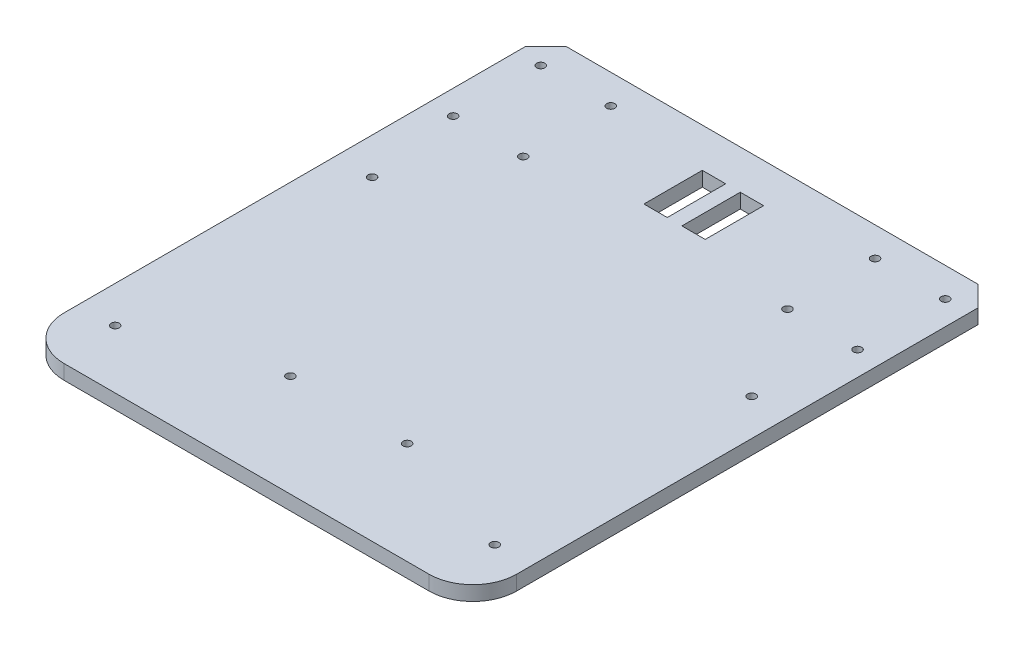
ISO-10303-21;
HEADER;
FILE_DESCRIPTION(('STEP AP214'),'2;1');
FILE_NAME('part.step','',(''),(''),'','','');
FILE_SCHEMA(('AUTOMOTIVE_DESIGN { 1 0 10303 214 1 1 1 1 }'));
ENDSEC;
DATA;
#1=APPLICATION_CONTEXT('core data for automotive mechanical design processes');
#2=APPLICATION_PROTOCOL_DEFINITION('international standard','automotive_design',2000,#1);
#3=PRODUCT_CONTEXT('',#1,'mechanical');
#4=PRODUCT('Part','Part','',(#3));
#5=PRODUCT_RELATED_PRODUCT_CATEGORY('part','',(#4));
#6=PRODUCT_DEFINITION_FORMATION('','',#4);
#7=PRODUCT_DEFINITION_CONTEXT('part definition',#1,'design');
#8=PRODUCT_DEFINITION('design','',#6,#7);
#9=PRODUCT_DEFINITION_SHAPE('','',#8);
#10=(LENGTH_UNIT() NAMED_UNIT(*) SI_UNIT(.MILLI.,.METRE.));
#11=(NAMED_UNIT(*) PLANE_ANGLE_UNIT() SI_UNIT($,.RADIAN.));
#12=(NAMED_UNIT(*) SI_UNIT($,.STERADIAN.) SOLID_ANGLE_UNIT());
#13=UNCERTAINTY_MEASURE_WITH_UNIT(LENGTH_MEASURE(1.E-05),#10,'distance_accuracy_value','');
#14=(GEOMETRIC_REPRESENTATION_CONTEXT(3) GLOBAL_UNCERTAINTY_ASSIGNED_CONTEXT((#13)) GLOBAL_UNIT_ASSIGNED_CONTEXT((#10,
#11,#12)) REPRESENTATION_CONTEXT('',''));
#15=CARTESIAN_POINT('',(0.,0.,0.));
#16=DIRECTION('',(0.,0.,1.));
#17=DIRECTION('',(1.,0.,0.));
#18=AXIS2_PLACEMENT_3D('',#15,#16,#17);
#19=CARTESIAN_POINT('',(-77.5,5.,90.));
#20=DIRECTION('',(1.,0.,0.));
#21=DIRECTION('',(0.,0.,-1.));
#22=AXIS2_PLACEMENT_3D('',#19,#20,#21);
#23=PLANE('',#22);
#24=DIRECTION('',(0.,0.,1.));
#25=VECTOR('',#24,1.);
#26=CARTESIAN_POINT('',(-77.5,5.,90.));
#27=LINE('',#26,#25);
#28=CARTESIAN_POINT('',(-77.5,5.,-83.));
#29=VERTEX_POINT('',#28);
#30=CARTESIAN_POINT('',(-77.5,5.,75.));
#31=VERTEX_POINT('',#30);
#32=EDGE_CURVE('E174',#29,#31,#27,.T.);
#33=ORIENTED_EDGE('',*,*,#32,.F.);
#34=DIRECTION('',(0.,1.,0.));
#35=VECTOR('',#34,1.);
#36=CARTESIAN_POINT('',(-77.5,0.,-83.));
#37=LINE('',#36,#35);
#38=CARTESIAN_POINT('',(-77.5,0.,-83.));
#39=VERTEX_POINT('',#38);
#40=EDGE_CURVE('E160',#39,#29,#37,.T.);
#41=ORIENTED_EDGE('',*,*,#40,.F.);
#42=DIRECTION('',(0.,0.,1.));
#43=VECTOR('',#42,1.);
#44=CARTESIAN_POINT('',(-77.5,0.,90.));
#45=LINE('',#44,#43);
#46=CARTESIAN_POINT('',(-77.5,0.,75.));
#47=VERTEX_POINT('',#46);
#48=EDGE_CURVE('E172',#39,#47,#45,.T.);
#49=ORIENTED_EDGE('',*,*,#48,.T.);
#50=DIRECTION('',(0.,1.,0.));
#51=VECTOR('',#50,1.);
#52=CARTESIAN_POINT('',(-77.5,0.,75.));
#53=LINE('',#52,#51);
#54=EDGE_CURVE('E330',#47,#31,#53,.T.);
#55=ORIENTED_EDGE('',*,*,#54,.T.);
#56=EDGE_LOOP('',(#33,#41,#49,#55));
#57=FACE_BOUND('',#56,.T.);
#58=ADVANCED_FACE('F45',(#57),#23,.F.);
#59=CARTESIAN_POINT('',(77.5,5.,90.));
#60=DIRECTION('',(0.,0.,-1.));
#61=DIRECTION('',(-1.,0.,0.));
#62=AXIS2_PLACEMENT_3D('',#59,#60,#61);
#63=PLANE('',#62);
#64=DIRECTION('',(1.,0.,0.));
#65=VECTOR('',#64,1.);
#66=CARTESIAN_POINT('',(77.5,5.,90.));
#67=LINE('',#66,#65);
#68=CARTESIAN_POINT('',(-62.5,5.,90.));
#69=VERTEX_POINT('',#68);
#70=CARTESIAN_POINT('',(62.5,5.,89.9999999999999));
#71=VERTEX_POINT('',#70);
#72=EDGE_CURVE('E440',#69,#71,#67,.T.);
#73=ORIENTED_EDGE('',*,*,#72,.F.);
#74=DIRECTION('',(0.,1.,0.));
#75=VECTOR('',#74,1.);
#76=CARTESIAN_POINT('',(-62.5,0.,90.));
#77=LINE('',#76,#75);
#78=CARTESIAN_POINT('',(-62.5,0.,90.));
#79=VERTEX_POINT('',#78);
#80=EDGE_CURVE('E324',#79,#69,#77,.T.);
#81=ORIENTED_EDGE('',*,*,#80,.F.);
#82=DIRECTION('',(1.,0.,0.));
#83=VECTOR('',#82,1.);
#84=CARTESIAN_POINT('',(77.5,0.,90.));
#85=LINE('',#84,#83);
#86=CARTESIAN_POINT('',(62.5,0.,90.));
#87=VERTEX_POINT('',#86);
#88=EDGE_CURVE('E182',#79,#87,#85,.T.);
#89=ORIENTED_EDGE('',*,*,#88,.T.);
#90=DIRECTION('',(0.,1.,0.));
#91=VECTOR('',#90,1.);
#92=CARTESIAN_POINT('',(62.5,0.,89.9999999999999));
#93=LINE('',#92,#91);
#94=EDGE_CURVE('E336',#87,#71,#93,.T.);
#95=ORIENTED_EDGE('',*,*,#94,.T.);
#96=EDGE_LOOP('',(#73,#81,#89,#95));
#97=FACE_BOUND('',#96,.T.);
#98=ADVANCED_FACE('F466',(#97),#63,.F.);
#99=CARTESIAN_POINT('',(77.5,5.,90.));
#100=DIRECTION('',(-1.,0.,0.));
#101=DIRECTION('',(0.,0.,1.));
#102=AXIS2_PLACEMENT_3D('',#99,#100,#101);
#103=PLANE('',#102);
#104=DIRECTION('',(0.,0.,-1.));
#105=VECTOR('',#104,1.);
#106=CARTESIAN_POINT('',(77.5,0.,90.));
#107=LINE('',#106,#105);
#108=CARTESIAN_POINT('',(77.5,0.,74.9999999999999));
#109=VERTEX_POINT('',#108);
#110=CARTESIAN_POINT('',(77.5,0.,-82.9999999999999));
#111=VERTEX_POINT('',#110);
#112=EDGE_CURVE('E188',#109,#111,#107,.T.);
#113=ORIENTED_EDGE('',*,*,#112,.T.);
#114=DIRECTION('',(0.,1.,0.));
#115=VECTOR('',#114,1.);
#116=CARTESIAN_POINT('',(77.5,0.,-83.));
#117=LINE('',#116,#115);
#118=CARTESIAN_POINT('',(77.5,5.,-83.));
#119=VERTEX_POINT('',#118);
#120=EDGE_CURVE('E62',#111,#119,#117,.T.);
#121=ORIENTED_EDGE('',*,*,#120,.T.);
#122=DIRECTION('',(0.,0.,-1.));
#123=VECTOR('',#122,1.);
#124=CARTESIAN_POINT('',(77.5,5.,90.));
#125=LINE('',#124,#123);
#126=CARTESIAN_POINT('',(77.5,5.,74.9999999999999));
#127=VERTEX_POINT('',#126);
#128=EDGE_CURVE('E54',#127,#119,#125,.T.);
#129=ORIENTED_EDGE('',*,*,#128,.F.);
#130=DIRECTION('',(0.,1.,0.));
#131=VECTOR('',#130,1.);
#132=CARTESIAN_POINT('',(77.5,0.,74.9999999999999));
#133=LINE('',#132,#131);
#134=EDGE_CURVE('E270',#109,#127,#133,.T.);
#135=ORIENTED_EDGE('',*,*,#134,.F.);
#136=EDGE_LOOP('',(#113,#121,#129,#135));
#137=FACE_BOUND('',#136,.T.);
#138=ADVANCED_FACE('F454',(#137),#103,.F.);
#139=CARTESIAN_POINT('',(77.5,5.,-90.));
#140=DIRECTION('',(0.,0.,1.));
#141=DIRECTION('',(1.,0.,0.));
#142=AXIS2_PLACEMENT_3D('',#139,#140,#141);
#143=PLANE('',#142);
#144=DIRECTION('',(-1.,0.,0.));
#145=VECTOR('',#144,1.);
#146=CARTESIAN_POINT('',(77.5,0.,-90.));
#147=LINE('',#146,#145);
#148=CARTESIAN_POINT('',(70.5,0.,-90.));
#149=VERTEX_POINT('',#148);
#150=CARTESIAN_POINT('',(-70.4999999999999,0.,-90.));
#151=VERTEX_POINT('',#150);
#152=EDGE_CURVE('E198',#149,#151,#147,.T.);
#153=ORIENTED_EDGE('',*,*,#152,.T.);
#154=DIRECTION('',(0.,1.,0.));
#155=VECTOR('',#154,1.);
#156=CARTESIAN_POINT('',(-70.5,0.,-90.));
#157=LINE('',#156,#155);
#158=CARTESIAN_POINT('',(-70.5,5.,-90.));
#159=VERTEX_POINT('',#158);
#160=EDGE_CURVE('E70',#151,#159,#157,.T.);
#161=ORIENTED_EDGE('',*,*,#160,.T.);
#162=DIRECTION('',(-1.,0.,0.));
#163=VECTOR('',#162,1.);
#164=CARTESIAN_POINT('',(77.5,5.,-90.));
#165=LINE('',#164,#163);
#166=CARTESIAN_POINT('',(70.5,5.,-90.));
#167=VERTEX_POINT('',#166);
#168=EDGE_CURVE('E11',#167,#159,#165,.T.);
#169=ORIENTED_EDGE('',*,*,#168,.F.);
#170=DIRECTION('',(0.,1.,0.));
#171=VECTOR('',#170,1.);
#172=CARTESIAN_POINT('',(70.5,0.,-90.));
#173=LINE('',#172,#171);
#174=EDGE_CURVE('E224',#149,#167,#173,.T.);
#175=ORIENTED_EDGE('',*,*,#174,.F.);
#176=EDGE_LOOP('',(#153,#161,#169,#175));
#177=FACE_BOUND('',#176,.T.);
#178=ADVANCED_FACE('F459',(#177),#143,.F.);
#179=CARTESIAN_POINT('',(0.,5.,0.));
#180=DIRECTION('',(0.,1.,0.));
#181=DIRECTION('',(0.,0.,1.));
#182=AXIS2_PLACEMENT_3D('',#179,#180,#181);
#183=PLANE('',#182);
#184=CARTESIAN_POINT('',(-20.,5.,55.));
#185=DIRECTION('',(0.,1.,0.));
#186=DIRECTION('',(0.,0.,1.));
#187=AXIS2_PLACEMENT_3D('',#184,#185,#186);
#188=CIRCLE('',#187,1.4);
#189=CARTESIAN_POINT('',(-20.,5.,56.4));
#190=VERTEX_POINT('',#189);
#191=EDGE_CURVE('E203',#190,#190,#188,.T.);
#192=ORIENTED_EDGE('',*,*,#191,.F.);
#193=EDGE_LOOP('',(#192));
#194=FACE_BOUND('',#193,.T.);
#195=CARTESIAN_POINT('',(20.,5.,54.9999999999999));
#196=DIRECTION('',(0.,1.,0.));
#197=DIRECTION('',(0.,0.,-1.));
#198=AXIS2_PLACEMENT_3D('',#195,#196,#197);
#199=CIRCLE('',#198,1.4);
#200=CARTESIAN_POINT('',(20.,5.,53.5999999999999));
#201=VERTEX_POINT('',#200);
#202=EDGE_CURVE('E210',#201,#201,#199,.T.);
#203=ORIENTED_EDGE('',*,*,#202,.F.);
#204=EDGE_LOOP('',(#203));
#205=FACE_BOUND('',#204,.T.);
#206=DIRECTION('',(0.707106781186547,0.,-0.707106781186547));
#207=VECTOR('',#206,1.);
#208=CARTESIAN_POINT('',(-70.5,5.,-90.));
#209=LINE('',#208,#207);
#210=EDGE_CURVE('E167',#29,#159,#209,.T.);
#211=ORIENTED_EDGE('',*,*,#210,.F.);
#212=ORIENTED_EDGE('',*,*,#32,.T.);
#213=CARTESIAN_POINT('',(-62.5,5.,75.));
#214=DIRECTION('',(0.,-1.,0.));
#215=DIRECTION('',(0.,0.,-1.));
#216=AXIS2_PLACEMENT_3D('',#213,#214,#215);
#217=CIRCLE('',#216,15.);
#218=EDGE_CURVE('E325',#69,#31,#217,.T.);
#219=ORIENTED_EDGE('',*,*,#218,.F.);
#220=ORIENTED_EDGE('',*,*,#72,.T.);
#221=CARTESIAN_POINT('',(62.5,5.,74.9999999999999));
#222=DIRECTION('',(0.,-1.,0.));
#223=DIRECTION('',(0.,0.,1.));
#224=AXIS2_PLACEMENT_3D('',#221,#222,#223);
#225=CIRCLE('',#224,15.);
#226=EDGE_CURVE('E329',#127,#71,#225,.T.);
#227=ORIENTED_EDGE('',*,*,#226,.F.);
#228=ORIENTED_EDGE('',*,*,#128,.T.);
#229=DIRECTION('',(0.707106781186547,0.,0.707106781186547));
#230=VECTOR('',#229,1.);
#231=CARTESIAN_POINT('',(70.5,5.,-90.));
#232=LINE('',#231,#230);
#233=EDGE_CURVE('E220',#167,#119,#232,.T.);
#234=ORIENTED_EDGE('',*,*,#233,.F.);
#235=ORIENTED_EDGE('',*,*,#168,.T.);
#236=EDGE_LOOP('',(#211,#212,#219,#220,#227,#228,#234,#235));
#237=FACE_BOUND('',#236,.T.);
#238=DIRECTION('',(0.,0.,-1.));
#239=VECTOR('',#238,1.);
#240=CARTESIAN_POINT('',(10.5,5.,-76.5855008301052));
#241=LINE('',#240,#239);
#242=CARTESIAN_POINT('',(10.5,5.,-56.5855008301052));
#243=VERTEX_POINT('',#242);
#244=CARTESIAN_POINT('',(10.5,5.,-76.5855008301052));
#245=VERTEX_POINT('',#244);
#246=EDGE_CURVE('E252',#243,#245,#241,.T.);
#247=ORIENTED_EDGE('',*,*,#246,.F.);
#248=DIRECTION('',(1.,0.,0.));
#249=VECTOR('',#248,1.);
#250=CARTESIAN_POINT('',(2.50000000000003,5.,-56.5855008301052));
#251=LINE('',#250,#249);
#252=CARTESIAN_POINT('',(2.50000000000003,5.,-56.5855008301052));
#253=VERTEX_POINT('',#252);
#254=EDGE_CURVE('E239',#253,#243,#251,.T.);
#255=ORIENTED_EDGE('',*,*,#254,.F.);
#256=DIRECTION('',(0.,0.,1.));
#257=VECTOR('',#256,1.);
#258=CARTESIAN_POINT('',(2.50000000000002,5.,-76.5855008301052));
#259=LINE('',#258,#257);
#260=CARTESIAN_POINT('',(2.50000000000002,5.,-76.5855008301052));
#261=VERTEX_POINT('',#260);
#262=EDGE_CURVE('E260',#261,#253,#259,.T.);
#263=ORIENTED_EDGE('',*,*,#262,.F.);
#264=DIRECTION('',(-1.,0.,0.));
#265=VECTOR('',#264,1.);
#266=CARTESIAN_POINT('',(2.50000000000002,5.,-76.5855008301052));
#267=LINE('',#266,#265);
#268=EDGE_CURVE('E255',#245,#261,#267,.T.);
#269=ORIENTED_EDGE('',*,*,#268,.F.);
#270=EDGE_LOOP('',(#247,#255,#263,#269));
#271=FACE_BOUND('',#270,.T.);
#272=DIRECTION('',(0.,0.,-1.));
#273=VECTOR('',#272,1.);
#274=CARTESIAN_POINT('',(-2.49999999999999,5.,-76.5855008301052));
#275=LINE('',#274,#273);
#276=CARTESIAN_POINT('',(-2.5,5.,-56.5855008301052));
#277=VERTEX_POINT('',#276);
#278=CARTESIAN_POINT('',(-2.49999999999999,5.,-76.5855008301052));
#279=VERTEX_POINT('',#278);
#280=EDGE_CURVE('E256',#277,#279,#275,.T.);
#281=ORIENTED_EDGE('',*,*,#280,.F.);
#282=DIRECTION('',(1.,0.,0.));
#283=VECTOR('',#282,1.);
#284=CARTESIAN_POINT('',(-2.5,5.,-56.5855008301052));
#285=LINE('',#284,#283);
#286=CARTESIAN_POINT('',(-10.5,5.,-56.5855008301052));
#287=VERTEX_POINT('',#286);
#288=EDGE_CURVE('E293',#287,#277,#285,.T.);
#289=ORIENTED_EDGE('',*,*,#288,.F.);
#290=DIRECTION('',(0.,0.,1.));
#291=VECTOR('',#290,1.);
#292=CARTESIAN_POINT('',(-10.5,5.,-76.5855008301052));
#293=LINE('',#292,#291);
#294=CARTESIAN_POINT('',(-10.5,5.,-76.5855008301052));
#295=VERTEX_POINT('',#294);
#296=EDGE_CURVE('E297',#295,#287,#293,.T.);
#297=ORIENTED_EDGE('',*,*,#296,.F.);
#298=DIRECTION('',(-1.,0.,0.));
#299=VECTOR('',#298,1.);
#300=CARTESIAN_POINT('',(-2.49999999999999,5.,-76.5855008301052));
#301=LINE('',#300,#299);
#302=EDGE_CURVE('E302',#279,#295,#301,.T.);
#303=ORIENTED_EDGE('',*,*,#302,.F.);
#304=EDGE_LOOP('',(#281,#289,#297,#303));
#305=FACE_BOUND('',#304,.T.);
#306=CARTESIAN_POINT('',(65.,5.,-18.));
#307=DIRECTION('',(0.,1.,0.));
#308=DIRECTION('',(0.,0.,-1.));
#309=AXIS2_PLACEMENT_3D('',#306,#307,#308);
#310=CIRCLE('',#309,1.4);
#311=CARTESIAN_POINT('',(65.,5.,-19.4));
#312=VERTEX_POINT('',#311);
#313=EDGE_CURVE('E356',#312,#312,#310,.T.);
#314=ORIENTED_EDGE('',*,*,#313,.F.);
#315=EDGE_LOOP('',(#314));
#316=FACE_BOUND('',#315,.T.);
#317=CARTESIAN_POINT('',(-65.,5.,70.));
#318=DIRECTION('',(0.,1.,0.));
#319=DIRECTION('',(0.,0.,1.));
#320=AXIS2_PLACEMENT_3D('',#317,#318,#319);
#321=CIRCLE('',#320,1.4);
#322=CARTESIAN_POINT('',(-65.,5.,71.4));
#323=VERTEX_POINT('',#322);
#324=EDGE_CURVE('E365',#323,#323,#321,.T.);
#325=ORIENTED_EDGE('',*,*,#324,.F.);
#326=EDGE_LOOP('',(#325));
#327=FACE_BOUND('',#326,.T.);
#328=CARTESIAN_POINT('',(65.,5.,69.9999999999999));
#329=DIRECTION('',(0.,1.,0.));
#330=DIRECTION('',(0.,0.,-1.));
#331=AXIS2_PLACEMENT_3D('',#328,#329,#330);
#332=CIRCLE('',#331,1.4);
#333=CARTESIAN_POINT('',(65.,5.,68.5999999999999));
#334=VERTEX_POINT('',#333);
#335=EDGE_CURVE('E348',#334,#334,#332,.T.);
#336=ORIENTED_EDGE('',*,*,#335,.F.);
#337=EDGE_LOOP('',(#336));
#338=FACE_BOUND('',#337,.T.);
#339=CARTESIAN_POINT('',(-65.,5.,-18.));
#340=DIRECTION('',(0.,1.,0.));
#341=DIRECTION('',(0.,0.,1.));
#342=AXIS2_PLACEMENT_3D('',#339,#340,#341);
#343=CIRCLE('',#342,1.4);
#344=CARTESIAN_POINT('',(-65.,5.,-16.6));
#345=VERTEX_POINT('',#344);
#346=EDGE_CURVE('E360',#345,#345,#343,.T.);
#347=ORIENTED_EDGE('',*,*,#346,.F.);
#348=EDGE_LOOP('',(#347));
#349=FACE_BOUND('',#348,.T.);
#350=CARTESIAN_POINT('',(-69.25,5.,-50.));
#351=DIRECTION('',(0.,1.,0.));
#352=DIRECTION('',(0.,0.,1.));
#353=AXIS2_PLACEMENT_3D('',#350,#351,#352);
#354=CIRCLE('',#353,1.4);
#355=CARTESIAN_POINT('',(-69.25,5.,-48.6));
#356=VERTEX_POINT('',#355);
#357=EDGE_CURVE('E404',#356,#356,#354,.T.);
#358=ORIENTED_EDGE('',*,*,#357,.F.);
#359=EDGE_LOOP('',(#358));
#360=FACE_BOUND('',#359,.T.);
#361=CARTESIAN_POINT('',(-45.25,5.,-50.));
#362=DIRECTION('',(0.,1.,0.));
#363=DIRECTION('',(0.,0.,1.));
#364=AXIS2_PLACEMENT_3D('',#361,#362,#363);
#365=CIRCLE('',#364,1.4);
#366=CARTESIAN_POINT('',(-45.25,5.,-48.6));
#367=VERTEX_POINT('',#366);
#368=EDGE_CURVE('E412',#367,#367,#365,.T.);
#369=ORIENTED_EDGE('',*,*,#368,.F.);
#370=EDGE_LOOP('',(#369));
#371=FACE_BOUND('',#370,.T.);
#372=CARTESIAN_POINT('',(-45.25,5.,-80.));
#373=DIRECTION('',(0.,1.,0.));
#374=DIRECTION('',(0.,0.,1.));
#375=AXIS2_PLACEMENT_3D('',#372,#373,#374);
#376=CIRCLE('',#375,1.4);
#377=CARTESIAN_POINT('',(-45.25,5.,-78.6));
#378=VERTEX_POINT('',#377);
#379=EDGE_CURVE('E420',#378,#378,#376,.T.);
#380=ORIENTED_EDGE('',*,*,#379,.F.);
#381=EDGE_LOOP('',(#380));
#382=FACE_BOUND('',#381,.T.);
#383=CARTESIAN_POINT('',(45.25,5.,-80.));
#384=DIRECTION('',(0.,1.,0.));
#385=DIRECTION('',(0.,0.,-1.));
#386=AXIS2_PLACEMENT_3D('',#383,#384,#385);
#387=CIRCLE('',#386,1.4);
#388=CARTESIAN_POINT('',(45.25,5.,-81.4));
#389=VERTEX_POINT('',#388);
#390=EDGE_CURVE('E428',#389,#389,#387,.T.);
#391=ORIENTED_EDGE('',*,*,#390,.F.);
#392=EDGE_LOOP('',(#391));
#393=FACE_BOUND('',#392,.T.);
#394=CARTESIAN_POINT('',(45.25,5.,-50.));
#395=DIRECTION('',(0.,1.,0.));
#396=DIRECTION('',(0.,0.,-1.));
#397=AXIS2_PLACEMENT_3D('',#394,#395,#396);
#398=CIRCLE('',#397,1.4);
#399=CARTESIAN_POINT('',(45.25,5.,-51.4));
#400=VERTEX_POINT('',#399);
#401=EDGE_CURVE('E380',#400,#400,#398,.T.);
#402=ORIENTED_EDGE('',*,*,#401,.F.);
#403=EDGE_LOOP('',(#402));
#404=FACE_BOUND('',#403,.T.);
#405=CARTESIAN_POINT('',(69.25,5.,-50.0000000000001));
#406=DIRECTION('',(0.,1.,0.));
#407=DIRECTION('',(0.,0.,-1.));
#408=AXIS2_PLACEMENT_3D('',#405,#406,#407);
#409=CIRCLE('',#408,1.4);
#410=CARTESIAN_POINT('',(69.25,5.,-51.4000000000001));
#411=VERTEX_POINT('',#410);
#412=EDGE_CURVE('E389',#411,#411,#409,.T.);
#413=ORIENTED_EDGE('',*,*,#412,.F.);
#414=EDGE_LOOP('',(#413));
#415=FACE_BOUND('',#414,.T.);
#416=CARTESIAN_POINT('',(69.25,5.,-80.));
#417=DIRECTION('',(0.,1.,0.));
#418=DIRECTION('',(0.,0.,-1.));
#419=AXIS2_PLACEMENT_3D('',#416,#417,#418);
#420=CIRCLE('',#419,1.4);
#421=CARTESIAN_POINT('',(69.25,5.,-81.4));
#422=VERTEX_POINT('',#421);
#423=EDGE_CURVE('E397',#422,#422,#420,.T.);
#424=ORIENTED_EDGE('',*,*,#423,.F.);
#425=EDGE_LOOP('',(#424));
#426=FACE_BOUND('',#425,.T.);
#427=CARTESIAN_POINT('',(-69.25,5.,-80.));
#428=DIRECTION('',(0.,1.,0.));
#429=DIRECTION('',(0.,0.,1.));
#430=AXIS2_PLACEMENT_3D('',#427,#428,#429);
#431=CIRCLE('',#430,1.4);
#432=CARTESIAN_POINT('',(-69.25,5.,-78.6));
#433=VERTEX_POINT('',#432);
#434=EDGE_CURVE('E191',#433,#433,#431,.T.);
#435=ORIENTED_EDGE('',*,*,#434,.F.);
#436=EDGE_LOOP('',(#435));
#437=FACE_BOUND('',#436,.T.);
#438=ADVANCED_FACE('F449',(#194,#205,#237,#271,#305,#316,#327,#338,#349,#360,#371,#382,#393,
#404,#415,#426,#437),#183,.T.);
#439=CARTESIAN_POINT('',(0.,0.,0.));
#440=DIRECTION('',(0.,1.,0.));
#441=DIRECTION('',(0.,0.,1.));
#442=AXIS2_PLACEMENT_3D('',#439,#440,#441);
#443=PLANE('',#442);
#444=CARTESIAN_POINT('',(-20.,0.,55.));
#445=DIRECTION('',(0.,1.,0.));
#446=DIRECTION('',(0.,0.,1.));
#447=AXIS2_PLACEMENT_3D('',#444,#445,#446);
#448=CIRCLE('',#447,1.4);
#449=CARTESIAN_POINT('',(-20.,0.,56.4));
#450=VERTEX_POINT('',#449);
#451=EDGE_CURVE('E48',#450,#450,#448,.T.);
#452=ORIENTED_EDGE('',*,*,#451,.T.);
#453=EDGE_LOOP('',(#452));
#454=FACE_BOUND('',#453,.T.);
#455=CARTESIAN_POINT('',(20.,0.,54.9999999999999));
#456=DIRECTION('',(0.,1.,0.));
#457=DIRECTION('',(0.,0.,1.));
#458=AXIS2_PLACEMENT_3D('',#455,#456,#457);
#459=CIRCLE('',#458,1.4);
#460=CARTESIAN_POINT('',(20.,0.,56.3999999999999));
#461=VERTEX_POINT('',#460);
#462=EDGE_CURVE('E200',#461,#461,#459,.T.);
#463=ORIENTED_EDGE('',*,*,#462,.T.);
#464=EDGE_LOOP('',(#463));
#465=FACE_BOUND('',#464,.T.);
#466=DIRECTION('',(1.,0.,0.));
#467=VECTOR('',#466,1.);
#468=CARTESIAN_POINT('',(2.50000000000003,0.,-56.5855008301052));
#469=LINE('',#468,#467);
#470=CARTESIAN_POINT('',(2.50000000000003,0.,-56.5855008301052));
#471=VERTEX_POINT('',#470);
#472=CARTESIAN_POINT('',(10.5,0.,-56.5855008301052));
#473=VERTEX_POINT('',#472);
#474=EDGE_CURVE('E247',#471,#473,#469,.T.);
#475=ORIENTED_EDGE('',*,*,#474,.T.);
#476=DIRECTION('',(0.,0.,-1.));
#477=VECTOR('',#476,1.);
#478=CARTESIAN_POINT('',(10.5,0.,-76.5855008301052));
#479=LINE('',#478,#477);
#480=CARTESIAN_POINT('',(10.5,0.,-76.5855008301052));
#481=VERTEX_POINT('',#480);
#482=EDGE_CURVE('E234',#473,#481,#479,.T.);
#483=ORIENTED_EDGE('',*,*,#482,.T.);
#484=DIRECTION('',(-1.,0.,0.));
#485=VECTOR('',#484,1.);
#486=CARTESIAN_POINT('',(2.50000000000002,0.,-76.5855008301052));
#487=LINE('',#486,#485);
#488=CARTESIAN_POINT('',(2.50000000000002,0.,-76.5855008301052));
#489=VERTEX_POINT('',#488);
#490=EDGE_CURVE('E238',#481,#489,#487,.T.);
#491=ORIENTED_EDGE('',*,*,#490,.T.);
#492=DIRECTION('',(0.,0.,1.));
#493=VECTOR('',#492,1.);
#494=CARTESIAN_POINT('',(2.50000000000002,0.,-76.5855008301052));
#495=LINE('',#494,#493);
#496=EDGE_CURVE('E243',#489,#471,#495,.T.);
#497=ORIENTED_EDGE('',*,*,#496,.T.);
#498=EDGE_LOOP('',(#475,#483,#491,#497));
#499=FACE_BOUND('',#498,.T.);
#500=DIRECTION('',(1.,0.,0.));
#501=VECTOR('',#500,1.);
#502=CARTESIAN_POINT('',(-2.5,0.,-56.5855008301052));
#503=LINE('',#502,#501);
#504=CARTESIAN_POINT('',(-10.5,0.,-56.5855008301052));
#505=VERTEX_POINT('',#504);
#506=CARTESIAN_POINT('',(-2.5,0.,-56.5855008301052));
#507=VERTEX_POINT('',#506);
#508=EDGE_CURVE('E284',#505,#507,#503,.T.);
#509=ORIENTED_EDGE('',*,*,#508,.T.);
#510=DIRECTION('',(0.,0.,-1.));
#511=VECTOR('',#510,1.);
#512=CARTESIAN_POINT('',(-2.49999999999999,0.,-76.5855008301052));
#513=LINE('',#512,#511);
#514=CARTESIAN_POINT('',(-2.49999999999999,0.,-76.5855008301052));
#515=VERTEX_POINT('',#514);
#516=EDGE_CURVE('E298',#507,#515,#513,.T.);
#517=ORIENTED_EDGE('',*,*,#516,.T.);
#518=DIRECTION('',(-1.,0.,0.));
#519=VECTOR('',#518,1.);
#520=CARTESIAN_POINT('',(-2.49999999999999,0.,-76.5855008301052));
#521=LINE('',#520,#519);
#522=CARTESIAN_POINT('',(-10.5,0.,-76.5855008301052));
#523=VERTEX_POINT('',#522);
#524=EDGE_CURVE('E315',#515,#523,#521,.T.);
#525=ORIENTED_EDGE('',*,*,#524,.T.);
#526=DIRECTION('',(0.,0.,1.));
#527=VECTOR('',#526,1.);
#528=CARTESIAN_POINT('',(-10.5,0.,-76.5855008301052));
#529=LINE('',#528,#527);
#530=EDGE_CURVE('E311',#523,#505,#529,.T.);
#531=ORIENTED_EDGE('',*,*,#530,.T.);
#532=EDGE_LOOP('',(#509,#517,#525,#531));
#533=FACE_BOUND('',#532,.T.);
#534=CARTESIAN_POINT('',(65.,0.,-18.));
#535=DIRECTION('',(0.,1.,0.));
#536=DIRECTION('',(0.,0.,-1.));
#537=AXIS2_PLACEMENT_3D('',#534,#535,#536);
#538=CIRCLE('',#537,1.4);
#539=CARTESIAN_POINT('',(65.,0.,-19.4));
#540=VERTEX_POINT('',#539);
#541=EDGE_CURVE('E361',#540,#540,#538,.T.);
#542=ORIENTED_EDGE('',*,*,#541,.T.);
#543=EDGE_LOOP('',(#542));
#544=FACE_BOUND('',#543,.T.);
#545=CARTESIAN_POINT('',(-65.,0.,70.));
#546=DIRECTION('',(0.,1.,0.));
#547=DIRECTION('',(0.,0.,1.));
#548=AXIS2_PLACEMENT_3D('',#545,#546,#547);
#549=CIRCLE('',#548,1.4);
#550=CARTESIAN_POINT('',(-65.,0.,71.4));
#551=VERTEX_POINT('',#550);
#552=EDGE_CURVE('E352',#551,#551,#549,.T.);
#553=ORIENTED_EDGE('',*,*,#552,.T.);
#554=EDGE_LOOP('',(#553));
#555=FACE_BOUND('',#554,.T.);
#556=CARTESIAN_POINT('',(65.,0.,69.9999999999999));
#557=DIRECTION('',(0.,1.,0.));
#558=DIRECTION('',(0.,0.,-1.));
#559=AXIS2_PLACEMENT_3D('',#556,#557,#558);
#560=CIRCLE('',#559,1.4);
#561=CARTESIAN_POINT('',(65.,0.,68.5999999999999));
#562=VERTEX_POINT('',#561);
#563=EDGE_CURVE('E333',#562,#562,#560,.T.);
#564=ORIENTED_EDGE('',*,*,#563,.T.);
#565=EDGE_LOOP('',(#564));
#566=FACE_BOUND('',#565,.T.);
#567=CARTESIAN_POINT('',(-65.,0.,-18.));
#568=DIRECTION('',(0.,1.,0.));
#569=DIRECTION('',(0.,0.,1.));
#570=AXIS2_PLACEMENT_3D('',#567,#568,#569);
#571=CIRCLE('',#570,1.4);
#572=CARTESIAN_POINT('',(-65.,0.,-16.6));
#573=VERTEX_POINT('',#572);
#574=EDGE_CURVE('E372',#573,#573,#571,.T.);
#575=ORIENTED_EDGE('',*,*,#574,.T.);
#576=EDGE_LOOP('',(#575));
#577=FACE_BOUND('',#576,.T.);
#578=CARTESIAN_POINT('',(-69.25,0.,-50.));
#579=DIRECTION('',(0.,1.,0.));
#580=DIRECTION('',(0.,0.,1.));
#581=AXIS2_PLACEMENT_3D('',#578,#579,#580);
#582=CIRCLE('',#581,1.4);
#583=CARTESIAN_POINT('',(-69.25,0.,-48.6));
#584=VERTEX_POINT('',#583);
#585=EDGE_CURVE('E408',#584,#584,#582,.T.);
#586=ORIENTED_EDGE('',*,*,#585,.T.);
#587=EDGE_LOOP('',(#586));
#588=FACE_BOUND('',#587,.T.);
#589=CARTESIAN_POINT('',(-45.25,0.,-50.));
#590=DIRECTION('',(0.,1.,0.));
#591=DIRECTION('',(0.,0.,1.));
#592=AXIS2_PLACEMENT_3D('',#589,#590,#591);
#593=CIRCLE('',#592,1.4);
#594=CARTESIAN_POINT('',(-45.25,0.,-48.6));
#595=VERTEX_POINT('',#594);
#596=EDGE_CURVE('E416',#595,#595,#593,.T.);
#597=ORIENTED_EDGE('',*,*,#596,.T.);
#598=EDGE_LOOP('',(#597));
#599=FACE_BOUND('',#598,.T.);
#600=CARTESIAN_POINT('',(-45.25,0.,-80.));
#601=DIRECTION('',(0.,1.,0.));
#602=DIRECTION('',(0.,0.,1.));
#603=AXIS2_PLACEMENT_3D('',#600,#601,#602);
#604=CIRCLE('',#603,1.4);
#605=CARTESIAN_POINT('',(-45.25,0.,-78.6));
#606=VERTEX_POINT('',#605);
#607=EDGE_CURVE('E424',#606,#606,#604,.T.);
#608=ORIENTED_EDGE('',*,*,#607,.T.);
#609=EDGE_LOOP('',(#608));
#610=FACE_BOUND('',#609,.T.);
#611=CARTESIAN_POINT('',(45.25,0.,-80.));
#612=DIRECTION('',(0.,1.,0.));
#613=DIRECTION('',(0.,0.,-1.));
#614=AXIS2_PLACEMENT_3D('',#611,#612,#613);
#615=CIRCLE('',#614,1.4);
#616=CARTESIAN_POINT('',(45.25,0.,-81.4));
#617=VERTEX_POINT('',#616);
#618=EDGE_CURVE('E384',#617,#617,#615,.T.);
#619=ORIENTED_EDGE('',*,*,#618,.T.);
#620=EDGE_LOOP('',(#619));
#621=FACE_BOUND('',#620,.T.);
#622=CARTESIAN_POINT('',(45.25,0.,-50.));
#623=DIRECTION('',(0.,1.,0.));
#624=DIRECTION('',(0.,0.,-1.));
#625=AXIS2_PLACEMENT_3D('',#622,#623,#624);
#626=CIRCLE('',#625,1.4);
#627=CARTESIAN_POINT('',(45.25,0.,-51.4));
#628=VERTEX_POINT('',#627);
#629=EDGE_CURVE('E385',#628,#628,#626,.T.);
#630=ORIENTED_EDGE('',*,*,#629,.T.);
#631=EDGE_LOOP('',(#630));
#632=FACE_BOUND('',#631,.T.);
#633=CARTESIAN_POINT('',(69.25,0.,-50.0000000000001));
#634=DIRECTION('',(0.,1.,0.));
#635=DIRECTION('',(0.,0.,-1.));
#636=AXIS2_PLACEMENT_3D('',#633,#634,#635);
#637=CIRCLE('',#636,1.4);
#638=CARTESIAN_POINT('',(69.25,0.,-51.4000000000001));
#639=VERTEX_POINT('',#638);
#640=EDGE_CURVE('E393',#639,#639,#637,.T.);
#641=ORIENTED_EDGE('',*,*,#640,.T.);
#642=EDGE_LOOP('',(#641));
#643=FACE_BOUND('',#642,.T.);
#644=CARTESIAN_POINT('',(69.25,0.,-80.));
#645=DIRECTION('',(0.,1.,0.));
#646=DIRECTION('',(0.,0.,-1.));
#647=AXIS2_PLACEMENT_3D('',#644,#645,#646);
#648=CIRCLE('',#647,1.4);
#649=CARTESIAN_POINT('',(69.25,0.,-81.4));
#650=VERTEX_POINT('',#649);
#651=EDGE_CURVE('E376',#650,#650,#648,.T.);
#652=ORIENTED_EDGE('',*,*,#651,.T.);
#653=EDGE_LOOP('',(#652));
#654=FACE_BOUND('',#653,.T.);
#655=CARTESIAN_POINT('',(-69.25,0.,-80.));
#656=DIRECTION('',(0.,1.,0.));
#657=DIRECTION('',(0.,0.,1.));
#658=AXIS2_PLACEMENT_3D('',#655,#656,#657);
#659=CIRCLE('',#658,1.4);
#660=CARTESIAN_POINT('',(-69.25,0.,-78.6));
#661=VERTEX_POINT('',#660);
#662=EDGE_CURVE('E183',#661,#661,#659,.T.);
#663=ORIENTED_EDGE('',*,*,#662,.T.);
#664=EDGE_LOOP('',(#663));
#665=FACE_BOUND('',#664,.T.);
#666=ORIENTED_EDGE('',*,*,#48,.F.);
#667=DIRECTION('',(0.707106781186547,0.,-0.707106781186547));
#668=VECTOR('',#667,1.);
#669=CARTESIAN_POINT('',(-70.5,0.,-90.));
#670=LINE('',#669,#668);
#671=EDGE_CURVE('E157',#39,#151,#670,.T.);
#672=ORIENTED_EDGE('',*,*,#671,.T.);
#673=ORIENTED_EDGE('',*,*,#152,.F.);
#674=DIRECTION('',(0.707106781186547,0.,0.707106781186547));
#675=VECTOR('',#674,1.);
#676=CARTESIAN_POINT('',(70.5,0.,-90.));
#677=LINE('',#676,#675);
#678=EDGE_CURVE('E227',#149,#111,#677,.T.);
#679=ORIENTED_EDGE('',*,*,#678,.T.);
#680=ORIENTED_EDGE('',*,*,#112,.F.);
#681=CARTESIAN_POINT('',(62.5,0.,74.9999999999999));
#682=DIRECTION('',(0.,-1.,0.));
#683=DIRECTION('',(0.,0.,1.));
#684=AXIS2_PLACEMENT_3D('',#681,#682,#683);
#685=CIRCLE('',#684,15.);
#686=EDGE_CURVE('E340',#109,#87,#685,.T.);
#687=ORIENTED_EDGE('',*,*,#686,.T.);
#688=ORIENTED_EDGE('',*,*,#88,.F.);
#689=CARTESIAN_POINT('',(-62.5,0.,75.));
#690=DIRECTION('',(0.,-1.,0.));
#691=DIRECTION('',(0.,0.,-1.));
#692=AXIS2_PLACEMENT_3D('',#689,#690,#691);
#693=CIRCLE('',#692,15.);
#694=EDGE_CURVE('E180',#79,#47,#693,.T.);
#695=ORIENTED_EDGE('',*,*,#694,.T.);
#696=EDGE_LOOP('',(#666,#672,#673,#679,#680,#687,#688,#695));
#697=FACE_BOUND('',#696,.T.);
#698=ADVANCED_FACE('F178',(#454,#465,#499,#533,#544,#555,#566,#577,#588,#599,#610,#621,#632,
#643,#654,#665,#697),#443,.F.);
#699=CARTESIAN_POINT('',(-69.25,0.,-80.));
#700=DIRECTION('',(0.,1.,0.));
#701=DIRECTION('',(0.,0.,1.));
#702=AXIS2_PLACEMENT_3D('',#699,#700,#701);
#703=CYLINDRICAL_SURFACE('',#702,1.4);
#704=ORIENTED_EDGE('',*,*,#662,.F.);
#705=EDGE_LOOP('',(#704));
#706=FACE_BOUND('',#705,.T.);
#707=ORIENTED_EDGE('',*,*,#434,.T.);
#708=EDGE_LOOP('',(#707));
#709=FACE_BOUND('',#708,.T.);
#710=ADVANCED_FACE('F495',(#706,#709),#703,.F.);
#711=CARTESIAN_POINT('',(69.25,0.,-80.));
#712=DIRECTION('',(0.,1.,0.));
#713=DIRECTION('',(0.,0.,1.));
#714=AXIS2_PLACEMENT_3D('',#711,#712,#713);
#715=CYLINDRICAL_SURFACE('',#714,1.4);
#716=ORIENTED_EDGE('',*,*,#651,.F.);
#717=EDGE_LOOP('',(#716));
#718=FACE_BOUND('',#717,.T.);
#719=ORIENTED_EDGE('',*,*,#423,.T.);
#720=EDGE_LOOP('',(#719));
#721=FACE_BOUND('',#720,.T.);
#722=ADVANCED_FACE('F502',(#718,#721),#715,.F.);
#723=CARTESIAN_POINT('',(69.25,0.,-50.0000000000001));
#724=DIRECTION('',(0.,1.,0.));
#725=DIRECTION('',(0.,0.,1.));
#726=AXIS2_PLACEMENT_3D('',#723,#724,#725);
#727=CYLINDRICAL_SURFACE('',#726,1.4);
#728=ORIENTED_EDGE('',*,*,#640,.F.);
#729=EDGE_LOOP('',(#728));
#730=FACE_BOUND('',#729,.T.);
#731=ORIENTED_EDGE('',*,*,#412,.T.);
#732=EDGE_LOOP('',(#731));
#733=FACE_BOUND('',#732,.T.);
#734=ADVANCED_FACE('F524',(#730,#733),#727,.F.);
#735=CARTESIAN_POINT('',(45.25,0.,-50.));
#736=DIRECTION('',(0.,1.,0.));
#737=DIRECTION('',(0.,0.,1.));
#738=AXIS2_PLACEMENT_3D('',#735,#736,#737);
#739=CYLINDRICAL_SURFACE('',#738,1.4);
#740=ORIENTED_EDGE('',*,*,#629,.F.);
#741=EDGE_LOOP('',(#740));
#742=FACE_BOUND('',#741,.T.);
#743=ORIENTED_EDGE('',*,*,#401,.T.);
#744=EDGE_LOOP('',(#743));
#745=FACE_BOUND('',#744,.T.);
#746=ADVANCED_FACE('F508',(#742,#745),#739,.F.);
#747=CARTESIAN_POINT('',(45.25,0.,-80.));
#748=DIRECTION('',(0.,1.,0.));
#749=DIRECTION('',(0.,0.,1.));
#750=AXIS2_PLACEMENT_3D('',#747,#748,#749);
#751=CYLINDRICAL_SURFACE('',#750,1.4);
#752=ORIENTED_EDGE('',*,*,#618,.F.);
#753=EDGE_LOOP('',(#752));
#754=FACE_BOUND('',#753,.T.);
#755=ORIENTED_EDGE('',*,*,#390,.T.);
#756=EDGE_LOOP('',(#755));
#757=FACE_BOUND('',#756,.T.);
#758=ADVANCED_FACE('F504',(#754,#757),#751,.F.);
#759=CARTESIAN_POINT('',(-45.25,0.,-80.));
#760=DIRECTION('',(0.,1.,0.));
#761=DIRECTION('',(0.,0.,1.));
#762=AXIS2_PLACEMENT_3D('',#759,#760,#761);
#763=CYLINDRICAL_SURFACE('',#762,1.4);
#764=ORIENTED_EDGE('',*,*,#607,.F.);
#765=EDGE_LOOP('',(#764));
#766=FACE_BOUND('',#765,.T.);
#767=ORIENTED_EDGE('',*,*,#379,.T.);
#768=EDGE_LOOP('',(#767));
#769=FACE_BOUND('',#768,.T.);
#770=ADVANCED_FACE('F507',(#766,#769),#763,.F.);
#771=CARTESIAN_POINT('',(-45.25,0.,-50.));
#772=DIRECTION('',(0.,1.,0.));
#773=DIRECTION('',(0.,0.,1.));
#774=AXIS2_PLACEMENT_3D('',#771,#772,#773);
#775=CYLINDRICAL_SURFACE('',#774,1.4);
#776=ORIENTED_EDGE('',*,*,#596,.F.);
#777=EDGE_LOOP('',(#776));
#778=FACE_BOUND('',#777,.T.);
#779=ORIENTED_EDGE('',*,*,#368,.T.);
#780=EDGE_LOOP('',(#779));
#781=FACE_BOUND('',#780,.T.);
#782=ADVANCED_FACE('F512',(#778,#781),#775,.F.);
#783=CARTESIAN_POINT('',(-69.25,0.,-50.));
#784=DIRECTION('',(0.,1.,0.));
#785=DIRECTION('',(0.,0.,1.));
#786=AXIS2_PLACEMENT_3D('',#783,#784,#785);
#787=CYLINDRICAL_SURFACE('',#786,1.4);
#788=ORIENTED_EDGE('',*,*,#585,.F.);
#789=EDGE_LOOP('',(#788));
#790=FACE_BOUND('',#789,.T.);
#791=ORIENTED_EDGE('',*,*,#357,.T.);
#792=EDGE_LOOP('',(#791));
#793=FACE_BOUND('',#792,.T.);
#794=ADVANCED_FACE('F516',(#790,#793),#787,.F.);
#795=CARTESIAN_POINT('',(-65.,0.,-18.));
#796=DIRECTION('',(0.,1.,0.));
#797=DIRECTION('',(0.,0.,1.));
#798=AXIS2_PLACEMENT_3D('',#795,#796,#797);
#799=CYLINDRICAL_SURFACE('',#798,1.4);
#800=ORIENTED_EDGE('',*,*,#574,.F.);
#801=EDGE_LOOP('',(#800));
#802=FACE_BOUND('',#801,.T.);
#803=ORIENTED_EDGE('',*,*,#346,.T.);
#804=EDGE_LOOP('',(#803));
#805=FACE_BOUND('',#804,.T.);
#806=ADVANCED_FACE('F520',(#802,#805),#799,.F.);
#807=CARTESIAN_POINT('',(65.,0.,69.9999999999999));
#808=DIRECTION('',(0.,1.,0.));
#809=DIRECTION('',(0.,0.,1.));
#810=AXIS2_PLACEMENT_3D('',#807,#808,#809);
#811=CYLINDRICAL_SURFACE('',#810,1.4);
#812=ORIENTED_EDGE('',*,*,#563,.F.);
#813=EDGE_LOOP('',(#812));
#814=FACE_BOUND('',#813,.T.);
#815=ORIENTED_EDGE('',*,*,#335,.T.);
#816=EDGE_LOOP('',(#815));
#817=FACE_BOUND('',#816,.T.);
#818=ADVANCED_FACE('F534',(#814,#817),#811,.F.);
#819=CARTESIAN_POINT('',(-65.,0.,70.));
#820=DIRECTION('',(0.,1.,0.));
#821=DIRECTION('',(0.,0.,1.));
#822=AXIS2_PLACEMENT_3D('',#819,#820,#821);
#823=CYLINDRICAL_SURFACE('',#822,1.4);
#824=ORIENTED_EDGE('',*,*,#552,.F.);
#825=EDGE_LOOP('',(#824));
#826=FACE_BOUND('',#825,.T.);
#827=ORIENTED_EDGE('',*,*,#324,.T.);
#828=EDGE_LOOP('',(#827));
#829=FACE_BOUND('',#828,.T.);
#830=ADVANCED_FACE('F478',(#826,#829),#823,.F.);
#831=CARTESIAN_POINT('',(65.,0.,-18.));
#832=DIRECTION('',(0.,1.,0.));
#833=DIRECTION('',(0.,0.,1.));
#834=AXIS2_PLACEMENT_3D('',#831,#832,#833);
#835=CYLINDRICAL_SURFACE('',#834,1.4);
#836=ORIENTED_EDGE('',*,*,#541,.F.);
#837=EDGE_LOOP('',(#836));
#838=FACE_BOUND('',#837,.T.);
#839=ORIENTED_EDGE('',*,*,#313,.T.);
#840=EDGE_LOOP('',(#839));
#841=FACE_BOUND('',#840,.T.);
#842=ADVANCED_FACE('F470',(#838,#841),#835,.F.);
#843=CARTESIAN_POINT('',(62.5,0.,74.9999999999999));
#844=DIRECTION('',(0.,1.,0.));
#845=DIRECTION('',(0.,0.,1.));
#846=AXIS2_PLACEMENT_3D('',#843,#844,#845);
#847=CYLINDRICAL_SURFACE('',#846,15.);
#848=ORIENTED_EDGE('',*,*,#226,.T.);
#849=ORIENTED_EDGE('',*,*,#94,.F.);
#850=ORIENTED_EDGE('',*,*,#686,.F.);
#851=ORIENTED_EDGE('',*,*,#134,.T.);
#852=EDGE_LOOP('',(#848,#849,#850,#851));
#853=FACE_BOUND('',#852,.T.);
#854=ADVANCED_FACE('F468',(#853),#847,.T.);
#855=CARTESIAN_POINT('',(-62.5,0.,75.));
#856=DIRECTION('',(0.,1.,0.));
#857=DIRECTION('',(0.,0.,1.));
#858=AXIS2_PLACEMENT_3D('',#855,#856,#857);
#859=CYLINDRICAL_SURFACE('',#858,15.);
#860=ORIENTED_EDGE('',*,*,#218,.T.);
#861=ORIENTED_EDGE('',*,*,#54,.F.);
#862=ORIENTED_EDGE('',*,*,#694,.F.);
#863=ORIENTED_EDGE('',*,*,#80,.T.);
#864=EDGE_LOOP('',(#860,#861,#862,#863));
#865=FACE_BOUND('',#864,.T.);
#866=ADVANCED_FACE('F463',(#865),#859,.T.);
#867=CARTESIAN_POINT('',(-2.49999999999999,0.,-76.5855008301052));
#868=DIRECTION('',(1.,0.,0.));
#869=DIRECTION('',(0.,0.,-1.));
#870=AXIS2_PLACEMENT_3D('',#867,#868,#869);
#871=PLANE('',#870);
#872=ORIENTED_EDGE('',*,*,#280,.T.);
#873=DIRECTION('',(0.,1.,0.));
#874=VECTOR('',#873,1.);
#875=CARTESIAN_POINT('',(-2.49999999999999,0.,-76.5855008301052));
#876=LINE('',#875,#874);
#877=EDGE_CURVE('E280',#515,#279,#876,.T.);
#878=ORIENTED_EDGE('',*,*,#877,.F.);
#879=ORIENTED_EDGE('',*,*,#516,.F.);
#880=DIRECTION('',(0.,1.,0.));
#881=VECTOR('',#880,1.);
#882=CARTESIAN_POINT('',(-2.5,0.,-56.5855008301052));
#883=LINE('',#882,#881);
#884=EDGE_CURVE('E222',#507,#277,#883,.T.);
#885=ORIENTED_EDGE('',*,*,#884,.T.);
#886=EDGE_LOOP('',(#872,#878,#879,#885));
#887=FACE_BOUND('',#886,.T.);
#888=ADVANCED_FACE('F476',(#887),#871,.F.);
#889=CARTESIAN_POINT('',(-2.5,0.,-56.5855008301052));
#890=DIRECTION('',(0.,0.,1.));
#891=DIRECTION('',(1.,0.,0.));
#892=AXIS2_PLACEMENT_3D('',#889,#890,#891);
#893=PLANE('',#892);
#894=ORIENTED_EDGE('',*,*,#288,.T.);
#895=ORIENTED_EDGE('',*,*,#884,.F.);
#896=ORIENTED_EDGE('',*,*,#508,.F.);
#897=DIRECTION('',(0.,1.,0.));
#898=VECTOR('',#897,1.);
#899=CARTESIAN_POINT('',(-10.5,0.,-56.5855008301052));
#900=LINE('',#899,#898);
#901=EDGE_CURVE('E288',#505,#287,#900,.T.);
#902=ORIENTED_EDGE('',*,*,#901,.T.);
#903=EDGE_LOOP('',(#894,#895,#896,#902));
#904=FACE_BOUND('',#903,.T.);
#905=ADVANCED_FACE('F630',(#904),#893,.F.);
#906=CARTESIAN_POINT('',(-10.5,0.,-76.5855008301052));
#907=DIRECTION('',(-1.,0.,0.));
#908=DIRECTION('',(0.,0.,1.));
#909=AXIS2_PLACEMENT_3D('',#906,#907,#908);
#910=PLANE('',#909);
#911=ORIENTED_EDGE('',*,*,#296,.T.);
#912=ORIENTED_EDGE('',*,*,#901,.F.);
#913=ORIENTED_EDGE('',*,*,#530,.F.);
#914=DIRECTION('',(0.,1.,0.));
#915=VECTOR('',#914,1.);
#916=CARTESIAN_POINT('',(-10.5,0.,-76.5855008301052));
#917=LINE('',#916,#915);
#918=EDGE_CURVE('E285',#523,#295,#917,.T.);
#919=ORIENTED_EDGE('',*,*,#918,.T.);
#920=EDGE_LOOP('',(#911,#912,#913,#919));
#921=FACE_BOUND('',#920,.T.);
#922=ADVANCED_FACE('F641',(#921),#910,.F.);
#923=CARTESIAN_POINT('',(-2.49999999999999,0.,-76.5855008301052));
#924=DIRECTION('',(0.,0.,-1.));
#925=DIRECTION('',(-1.,0.,0.));
#926=AXIS2_PLACEMENT_3D('',#923,#924,#925);
#927=PLANE('',#926);
#928=ORIENTED_EDGE('',*,*,#302,.T.);
#929=ORIENTED_EDGE('',*,*,#918,.F.);
#930=ORIENTED_EDGE('',*,*,#524,.F.);
#931=ORIENTED_EDGE('',*,*,#877,.T.);
#932=EDGE_LOOP('',(#928,#929,#930,#931));
#933=FACE_BOUND('',#932,.T.);
#934=ADVANCED_FACE('F652',(#933),#927,.F.);
#935=CARTESIAN_POINT('',(10.5,0.,-76.5855008301052));
#936=DIRECTION('',(1.,0.,0.));
#937=DIRECTION('',(0.,0.,-1.));
#938=AXIS2_PLACEMENT_3D('',#935,#936,#937);
#939=PLANE('',#938);
#940=ORIENTED_EDGE('',*,*,#246,.T.);
#941=DIRECTION('',(0.,1.,0.));
#942=VECTOR('',#941,1.);
#943=CARTESIAN_POINT('',(10.5,0.,-76.5855008301052));
#944=LINE('',#943,#942);
#945=EDGE_CURVE('E251',#481,#245,#944,.T.);
#946=ORIENTED_EDGE('',*,*,#945,.F.);
#947=ORIENTED_EDGE('',*,*,#482,.F.);
#948=DIRECTION('',(0.,1.,0.));
#949=VECTOR('',#948,1.);
#950=CARTESIAN_POINT('',(10.5,0.,-56.5855008301052));
#951=LINE('',#950,#949);
#952=EDGE_CURVE('E267',#473,#243,#951,.T.);
#953=ORIENTED_EDGE('',*,*,#952,.T.);
#954=EDGE_LOOP('',(#940,#946,#947,#953));
#955=FACE_BOUND('',#954,.T.);
#956=ADVANCED_FACE('F663',(#955),#939,.F.);
#957=CARTESIAN_POINT('',(2.50000000000003,0.,-56.5855008301052));
#958=DIRECTION('',(0.,0.,1.));
#959=DIRECTION('',(1.,0.,0.));
#960=AXIS2_PLACEMENT_3D('',#957,#958,#959);
#961=PLANE('',#960);
#962=ORIENTED_EDGE('',*,*,#254,.T.);
#963=ORIENTED_EDGE('',*,*,#952,.F.);
#964=ORIENTED_EDGE('',*,*,#474,.F.);
#965=DIRECTION('',(0.,1.,0.));
#966=VECTOR('',#965,1.);
#967=CARTESIAN_POINT('',(2.50000000000003,0.,-56.5855008301052));
#968=LINE('',#967,#966);
#969=EDGE_CURVE('E271',#471,#253,#968,.T.);
#970=ORIENTED_EDGE('',*,*,#969,.T.);
#971=EDGE_LOOP('',(#962,#963,#964,#970));
#972=FACE_BOUND('',#971,.T.);
#973=ADVANCED_FACE('F674',(#972),#961,.F.);
#974=CARTESIAN_POINT('',(2.50000000000002,0.,-76.5855008301052));
#975=DIRECTION('',(-1.,0.,0.));
#976=DIRECTION('',(0.,0.,1.));
#977=AXIS2_PLACEMENT_3D('',#974,#975,#976);
#978=PLANE('',#977);
#979=ORIENTED_EDGE('',*,*,#262,.T.);
#980=ORIENTED_EDGE('',*,*,#969,.F.);
#981=ORIENTED_EDGE('',*,*,#496,.F.);
#982=DIRECTION('',(0.,1.,0.));
#983=VECTOR('',#982,1.);
#984=CARTESIAN_POINT('',(2.50000000000002,0.,-76.5855008301052));
#985=LINE('',#984,#983);
#986=EDGE_CURVE('E274',#489,#261,#985,.T.);
#987=ORIENTED_EDGE('',*,*,#986,.T.);
#988=EDGE_LOOP('',(#979,#980,#981,#987));
#989=FACE_BOUND('',#988,.T.);
#990=ADVANCED_FACE('F685',(#989),#978,.F.);
#991=CARTESIAN_POINT('',(2.50000000000002,0.,-76.5855008301052));
#992=DIRECTION('',(0.,0.,-1.));
#993=DIRECTION('',(-1.,0.,0.));
#994=AXIS2_PLACEMENT_3D('',#991,#992,#993);
#995=PLANE('',#994);
#996=ORIENTED_EDGE('',*,*,#268,.T.);
#997=ORIENTED_EDGE('',*,*,#986,.F.);
#998=ORIENTED_EDGE('',*,*,#490,.F.);
#999=ORIENTED_EDGE('',*,*,#945,.T.);
#1000=EDGE_LOOP('',(#996,#997,#998,#999));
#1001=FACE_BOUND('',#1000,.T.);
#1002=ADVANCED_FACE('F696',(#1001),#995,.F.);
#1003=CARTESIAN_POINT('',(70.5,0.,-90.));
#1004=DIRECTION('',(-0.707106781186548,0.,0.707106781186548));
#1005=DIRECTION('',(0.707106781186548,0.,0.707106781186548));
#1006=AXIS2_PLACEMENT_3D('',#1003,#1004,#1005);
#1007=PLANE('',#1006);
#1008=ORIENTED_EDGE('',*,*,#233,.T.);
#1009=ORIENTED_EDGE('',*,*,#120,.F.);
#1010=ORIENTED_EDGE('',*,*,#678,.F.);
#1011=ORIENTED_EDGE('',*,*,#174,.T.);
#1012=EDGE_LOOP('',(#1008,#1009,#1010,#1011));
#1013=FACE_BOUND('',#1012,.T.);
#1014=ADVANCED_FACE('F457',(#1013),#1007,.F.);
#1015=CARTESIAN_POINT('',(-70.5,0.,-90.));
#1016=DIRECTION('',(0.707106781186548,0.,0.707106781186548));
#1017=DIRECTION('',(0.707106781186548,0.,-0.707106781186548));
#1018=AXIS2_PLACEMENT_3D('',#1015,#1016,#1017);
#1019=PLANE('',#1018);
#1020=ORIENTED_EDGE('',*,*,#210,.T.);
#1021=ORIENTED_EDGE('',*,*,#160,.F.);
#1022=ORIENTED_EDGE('',*,*,#671,.F.);
#1023=ORIENTED_EDGE('',*,*,#40,.T.);
#1024=EDGE_LOOP('',(#1020,#1021,#1022,#1023));
#1025=FACE_BOUND('',#1024,.T.);
#1026=ADVANCED_FACE('F159',(#1025),#1019,.F.);
#1027=CARTESIAN_POINT('',(20.,-5.,54.9999999999999));
#1028=DIRECTION('',(0.,1.,0.));
#1029=DIRECTION('',(0.,0.,1.));
#1030=AXIS2_PLACEMENT_3D('',#1027,#1028,#1029);
#1031=CYLINDRICAL_SURFACE('',#1030,1.4);
#1032=ORIENTED_EDGE('',*,*,#202,.T.);
#1033=EDGE_LOOP('',(#1032));
#1034=FACE_BOUND('',#1033,.T.);
#1035=ORIENTED_EDGE('',*,*,#462,.F.);
#1036=EDGE_LOOP('',(#1035));
#1037=FACE_BOUND('',#1036,.T.);
#1038=ADVANCED_FACE('F743',(#1034,#1037),#1031,.F.);
#1039=CARTESIAN_POINT('',(-20.,-5.,55.));
#1040=DIRECTION('',(0.,1.,0.));
#1041=DIRECTION('',(0.,0.,1.));
#1042=AXIS2_PLACEMENT_3D('',#1039,#1040,#1041);
#1043=CYLINDRICAL_SURFACE('',#1042,1.4);
#1044=ORIENTED_EDGE('',*,*,#191,.T.);
#1045=EDGE_LOOP('',(#1044));
#1046=FACE_BOUND('',#1045,.T.);
#1047=ORIENTED_EDGE('',*,*,#451,.F.);
#1048=EDGE_LOOP('',(#1047));
#1049=FACE_BOUND('',#1048,.T.);
#1050=ADVANCED_FACE('F767',(#1046,#1049),#1043,.F.);
#1051=CLOSED_SHELL('',(#58,#98,#138,#178,#438,#698,#710,#722,#734,#746,#758,#770,#782,#794,#806,
#818,#830,#842,#854,#866,#888,#905,#922,#934,#956,#973,#990,#1002,#1014,#1026,#1038,#1050));
#1052=MANIFOLD_SOLID_BREP('B2',#1051);
#1053=ADVANCED_BREP_SHAPE_REPRESENTATION('',(#18,#1052),#14);
#1054=SHAPE_DEFINITION_REPRESENTATION(#9,#1053);
ENDSEC;
END-ISO-10303-21;
